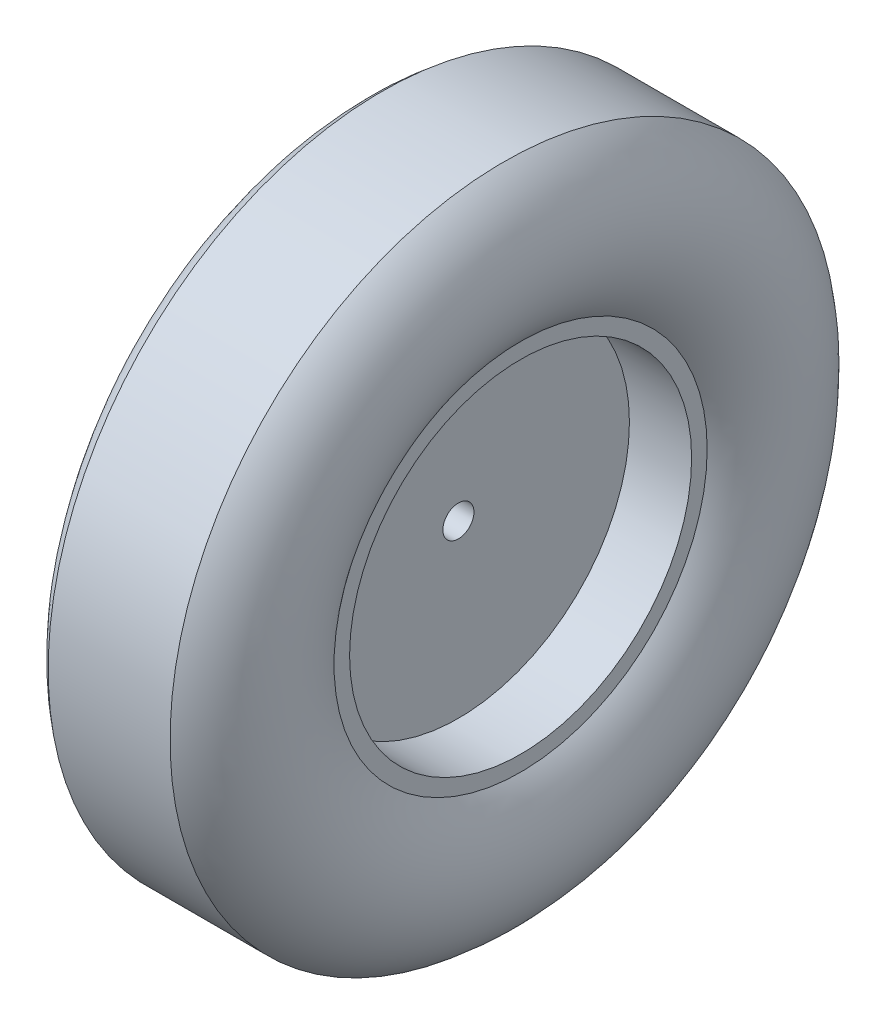
ISO-10303-21;
HEADER;
FILE_DESCRIPTION(('STEP AP214'),'2;1');
FILE_NAME('part.step','',(''),(''),'','','');
FILE_SCHEMA(('AUTOMOTIVE_DESIGN { 1 0 10303 214 1 1 1 1 }'));
ENDSEC;
DATA;
#1=APPLICATION_CONTEXT('core data for automotive mechanical design processes');
#2=APPLICATION_PROTOCOL_DEFINITION('international standard','automotive_design',2000,#1);
#3=PRODUCT_CONTEXT('',#1,'mechanical');
#4=PRODUCT('Part','Part','',(#3));
#5=PRODUCT_RELATED_PRODUCT_CATEGORY('part','',(#4));
#6=PRODUCT_DEFINITION_FORMATION('','',#4);
#7=PRODUCT_DEFINITION_CONTEXT('part definition',#1,'design');
#8=PRODUCT_DEFINITION('design','',#6,#7);
#9=PRODUCT_DEFINITION_SHAPE('','',#8);
#10=(LENGTH_UNIT() NAMED_UNIT(*) SI_UNIT(.MILLI.,.METRE.));
#11=(NAMED_UNIT(*) PLANE_ANGLE_UNIT() SI_UNIT($,.RADIAN.));
#12=(NAMED_UNIT(*) SI_UNIT($,.STERADIAN.) SOLID_ANGLE_UNIT());
#13=UNCERTAINTY_MEASURE_WITH_UNIT(LENGTH_MEASURE(1.E-05),#10,'distance_accuracy_value','');
#14=(GEOMETRIC_REPRESENTATION_CONTEXT(3) GLOBAL_UNCERTAINTY_ASSIGNED_CONTEXT((#13)) GLOBAL_UNIT_ASSIGNED_CONTEXT((#10,
#11,#12)) REPRESENTATION_CONTEXT('',''));
#15=CARTESIAN_POINT('',(0.,0.,0.));
#16=DIRECTION('',(0.,0.,1.));
#17=DIRECTION('',(1.,0.,0.));
#18=AXIS2_PLACEMENT_3D('',#15,#16,#17);
#19=CARTESIAN_POINT('',(63.5,0.,0.));
#20=DIRECTION('',(1.,0.,0.));
#21=DIRECTION('',(0.,0.,-1.));
#22=AXIS2_PLACEMENT_3D('',#19,#20,#21);
#23=PLANE('',#22);
#24=CARTESIAN_POINT('',(63.5,0.,0.));
#25=DIRECTION('',(1.,0.,0.));
#26=DIRECTION('',(0.,0.,-1.));
#27=AXIS2_PLACEMENT_3D('',#24,#25,#26);
#28=CIRCLE('',#27,152.4);
#29=CARTESIAN_POINT('',(63.5,0.,-152.4));
#30=VERTEX_POINT('',#29);
#31=EDGE_CURVE('E10',#30,#30,#28,.T.);
#32=ORIENTED_EDGE('',*,*,#31,.T.);
#33=EDGE_LOOP('',(#32));
#34=FACE_BOUND('',#33,.T.);
#35=CARTESIAN_POINT('',(63.5,0.,0.));
#36=DIRECTION('',(1.,0.,0.));
#37=DIRECTION('',(0.,0.,-1.));
#38=AXIS2_PLACEMENT_3D('',#35,#36,#37);
#39=CIRCLE('',#38,139.7);
#40=CARTESIAN_POINT('',(63.5,0.,-139.7));
#41=VERTEX_POINT('',#40);
#42=EDGE_CURVE('E70',#41,#41,#39,.T.);
#43=ORIENTED_EDGE('',*,*,#42,.F.);
#44=EDGE_LOOP('',(#43));
#45=FACE_BOUND('',#44,.T.);
#46=ADVANCED_FACE('F36',(#34,#45),#23,.T.);
#47=CARTESIAN_POINT('',(0.,0.,0.));
#48=DIRECTION('',(1.,0.,0.));
#49=DIRECTION('',(0.,0.,-1.));
#50=AXIS2_PLACEMENT_3D('',#47,#48,#49);
#51=TOROIDAL_SURFACE('',#50,206.053600850508,83.1321771892548);
#52=CARTESIAN_POINT('',(49.7956359100603,0.,0.));
#53=DIRECTION('',(1.,0.,0.));
#54=DIRECTION('',(0.,0.,-1.));
#55=AXIS2_PLACEMENT_3D('',#52,#53,#54);
#56=CIRCLE('',#55,272.622013243612);
#57=CARTESIAN_POINT('',(49.7956359100603,0.,-272.622013243612));
#58=VERTEX_POINT('',#57);
#59=EDGE_CURVE('E42',#58,#58,#56,.T.);
#60=ORIENTED_EDGE('',*,*,#59,.T.);
#61=EDGE_LOOP('',(#60));
#62=FACE_BOUND('',#61,.T.);
#63=ORIENTED_EDGE('',*,*,#31,.F.);
#64=EDGE_LOOP('',(#63));
#65=FACE_BOUND('',#64,.T.);
#66=ADVANCED_FACE('F78',(#62,#65),#51,.T.);
#67=CARTESIAN_POINT('',(12.7,0.,0.));
#68=DIRECTION('',(1.,0.,0.));
#69=DIRECTION('',(0.,0.,-1.));
#70=AXIS2_PLACEMENT_3D('',#67,#68,#69);
#71=CYLINDRICAL_SURFACE('',#70,272.622013243612);
#72=CARTESIAN_POINT('',(-49.7956359100603,0.,0.));
#73=DIRECTION('',(1.,0.,0.));
#74=DIRECTION('',(0.,0.,-1.));
#75=AXIS2_PLACEMENT_3D('',#72,#73,#74);
#76=CIRCLE('',#75,272.622013243612);
#77=CARTESIAN_POINT('',(-49.7956359100603,0.,-272.622013243612));
#78=VERTEX_POINT('',#77);
#79=EDGE_CURVE('E46',#78,#78,#76,.T.);
#80=ORIENTED_EDGE('',*,*,#79,.T.);
#81=EDGE_LOOP('',(#80));
#82=FACE_BOUND('',#81,.T.);
#83=ORIENTED_EDGE('',*,*,#59,.F.);
#84=EDGE_LOOP('',(#83));
#85=FACE_BOUND('',#84,.T.);
#86=ADVANCED_FACE('F82',(#82,#85),#71,.T.);
#87=CARTESIAN_POINT('',(-63.5,0.,0.));
#88=DIRECTION('',(1.,0.,0.));
#89=DIRECTION('',(0.,0.,-1.));
#90=AXIS2_PLACEMENT_3D('',#87,#88,#89);
#91=CIRCLE('',#90,152.4);
#92=CARTESIAN_POINT('',(-63.5,0.,-152.4));
#93=VERTEX_POINT('',#92);
#94=EDGE_CURVE('E50',#93,#93,#91,.T.);
#95=ORIENTED_EDGE('',*,*,#94,.T.);
#96=EDGE_LOOP('',(#95));
#97=FACE_BOUND('',#96,.T.);
#98=ORIENTED_EDGE('',*,*,#79,.F.);
#99=EDGE_LOOP('',(#98));
#100=FACE_BOUND('',#99,.T.);
#101=ADVANCED_FACE('F84',(#97,#100),#51,.T.);
#102=CARTESIAN_POINT('',(-63.5,0.,0.));
#103=DIRECTION('',(1.,0.,0.));
#104=DIRECTION('',(0.,0.,-1.));
#105=AXIS2_PLACEMENT_3D('',#102,#103,#104);
#106=PLANE('',#105);
#107=ORIENTED_EDGE('',*,*,#94,.F.);
#108=EDGE_LOOP('',(#107));
#109=FACE_BOUND('',#108,.T.);
#110=CARTESIAN_POINT('',(-63.5,0.,0.));
#111=DIRECTION('',(1.,0.,0.));
#112=DIRECTION('',(0.,0.,-1.));
#113=AXIS2_PLACEMENT_3D('',#110,#111,#112);
#114=CIRCLE('',#113,139.7);
#115=CARTESIAN_POINT('',(-63.5,0.,-139.7));
#116=VERTEX_POINT('',#115);
#117=EDGE_CURVE('E55',#116,#116,#114,.T.);
#118=ORIENTED_EDGE('',*,*,#117,.T.);
#119=EDGE_LOOP('',(#118));
#120=FACE_BOUND('',#119,.T.);
#121=ADVANCED_FACE('F92',(#109,#120),#106,.F.);
#122=CARTESIAN_POINT('',(12.7,0.,0.));
#123=DIRECTION('',(1.,0.,0.));
#124=DIRECTION('',(0.,0.,-1.));
#125=AXIS2_PLACEMENT_3D('',#122,#123,#124);
#126=CYLINDRICAL_SURFACE('',#125,139.7);
#127=ORIENTED_EDGE('',*,*,#117,.F.);
#128=EDGE_LOOP('',(#127));
#129=FACE_BOUND('',#128,.T.);
#130=CARTESIAN_POINT('',(-12.7,0.,0.));
#131=DIRECTION('',(1.,0.,0.));
#132=DIRECTION('',(0.,0.,-1.));
#133=AXIS2_PLACEMENT_3D('',#130,#131,#132);
#134=CIRCLE('',#133,139.7);
#135=CARTESIAN_POINT('',(-12.7,0.,-139.7));
#136=VERTEX_POINT('',#135);
#137=EDGE_CURVE('E58',#136,#136,#134,.T.);
#138=ORIENTED_EDGE('',*,*,#137,.T.);
#139=EDGE_LOOP('',(#138));
#140=FACE_BOUND('',#139,.T.);
#141=ADVANCED_FACE('F97',(#129,#140),#126,.F.);
#142=CARTESIAN_POINT('',(-12.7,0.,0.));
#143=DIRECTION('',(1.,0.,0.));
#144=DIRECTION('',(0.,0.,-1.));
#145=AXIS2_PLACEMENT_3D('',#142,#143,#144);
#146=PLANE('',#145);
#147=ORIENTED_EDGE('',*,*,#137,.F.);
#148=EDGE_LOOP('',(#147));
#149=FACE_BOUND('',#148,.T.);
#150=CARTESIAN_POINT('',(-12.7,0.,0.));
#151=DIRECTION('',(1.,0.,0.));
#152=DIRECTION('',(0.,0.,-1.));
#153=AXIS2_PLACEMENT_3D('',#150,#151,#152);
#154=CIRCLE('',#153,12.7);
#155=CARTESIAN_POINT('',(-12.7,0.,-12.7));
#156=VERTEX_POINT('',#155);
#157=EDGE_CURVE('E61',#156,#156,#154,.T.);
#158=ORIENTED_EDGE('',*,*,#157,.T.);
#159=EDGE_LOOP('',(#158));
#160=FACE_BOUND('',#159,.T.);
#161=ADVANCED_FACE('F108',(#149,#160),#146,.F.);
#162=CARTESIAN_POINT('',(12.7,0.,0.));
#163=DIRECTION('',(1.,0.,0.));
#164=DIRECTION('',(0.,0.,-1.));
#165=AXIS2_PLACEMENT_3D('',#162,#163,#164);
#166=CYLINDRICAL_SURFACE('',#165,12.7);
#167=ORIENTED_EDGE('',*,*,#157,.F.);
#168=EDGE_LOOP('',(#167));
#169=FACE_BOUND('',#168,.T.);
#170=CARTESIAN_POINT('',(12.7,0.,0.));
#171=DIRECTION('',(1.,0.,0.));
#172=DIRECTION('',(0.,0.,-1.));
#173=AXIS2_PLACEMENT_3D('',#170,#171,#172);
#174=CIRCLE('',#173,12.7);
#175=CARTESIAN_POINT('',(12.7,0.,-12.7));
#176=VERTEX_POINT('',#175);
#177=EDGE_CURVE('E64',#176,#176,#174,.T.);
#178=ORIENTED_EDGE('',*,*,#177,.T.);
#179=EDGE_LOOP('',(#178));
#180=FACE_BOUND('',#179,.T.);
#181=ADVANCED_FACE('F114',(#169,#180),#166,.F.);
#182=CARTESIAN_POINT('',(12.7,0.,0.));
#183=DIRECTION('',(1.,0.,0.));
#184=DIRECTION('',(0.,0.,-1.));
#185=AXIS2_PLACEMENT_3D('',#182,#183,#184);
#186=PLANE('',#185);
#187=CARTESIAN_POINT('',(12.7,0.,0.));
#188=DIRECTION('',(1.,0.,0.));
#189=DIRECTION('',(0.,0.,-1.));
#190=AXIS2_PLACEMENT_3D('',#187,#188,#189);
#191=CIRCLE('',#190,139.7);
#192=CARTESIAN_POINT('',(12.7,0.,-139.7));
#193=VERTEX_POINT('',#192);
#194=EDGE_CURVE('E67',#193,#193,#191,.T.);
#195=ORIENTED_EDGE('',*,*,#194,.T.);
#196=EDGE_LOOP('',(#195));
#197=FACE_BOUND('',#196,.T.);
#198=ORIENTED_EDGE('',*,*,#177,.F.);
#199=EDGE_LOOP('',(#198));
#200=FACE_BOUND('',#199,.T.);
#201=ADVANCED_FACE('F120',(#197,#200),#186,.T.);
#202=CARTESIAN_POINT('',(12.7,0.,0.));
#203=DIRECTION('',(1.,0.,0.));
#204=DIRECTION('',(0.,0.,-1.));
#205=AXIS2_PLACEMENT_3D('',#202,#203,#204);
#206=CYLINDRICAL_SURFACE('',#205,139.7);
#207=ORIENTED_EDGE('',*,*,#42,.T.);
#208=EDGE_LOOP('',(#207));
#209=FACE_BOUND('',#208,.T.);
#210=ORIENTED_EDGE('',*,*,#194,.F.);
#211=EDGE_LOOP('',(#210));
#212=FACE_BOUND('',#211,.T.);
#213=ADVANCED_FACE('F74',(#209,#212),#206,.F.);
#214=CLOSED_SHELL('',(#46,#66,#86,#101,#121,#141,#161,#181,#201,#213));
#215=MANIFOLD_SOLID_BREP('B2',#214);
#216=ADVANCED_BREP_SHAPE_REPRESENTATION('',(#18,#215),#14);
#217=SHAPE_DEFINITION_REPRESENTATION(#9,#216);
ENDSEC;
END-ISO-10303-21;
